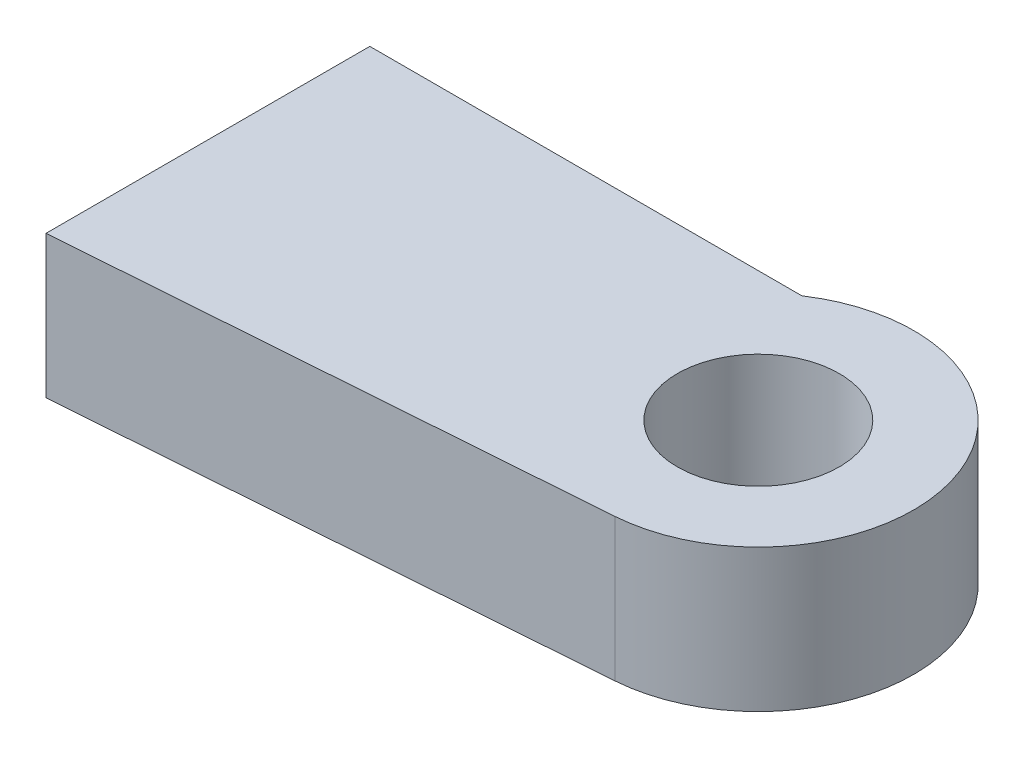
ISO-10303-21;
HEADER;
FILE_DESCRIPTION(('STEP AP214'),'2;1');
FILE_NAME('part.step','',(''),(''),'','','');
FILE_SCHEMA(('AUTOMOTIVE_DESIGN { 1 0 10303 214 1 1 1 1 }'));
ENDSEC;
DATA;
#1=APPLICATION_CONTEXT('core data for automotive mechanical design processes');
#2=APPLICATION_PROTOCOL_DEFINITION('international standard','automotive_design',2000,#1);
#3=PRODUCT_CONTEXT('',#1,'mechanical');
#4=PRODUCT('Part','Part','',(#3));
#5=PRODUCT_RELATED_PRODUCT_CATEGORY('part','',(#4));
#6=PRODUCT_DEFINITION_FORMATION('','',#4);
#7=PRODUCT_DEFINITION_CONTEXT('part definition',#1,'design');
#8=PRODUCT_DEFINITION('design','',#6,#7);
#9=PRODUCT_DEFINITION_SHAPE('','',#8);
#10=(LENGTH_UNIT() NAMED_UNIT(*) SI_UNIT(.MILLI.,.METRE.));
#11=(NAMED_UNIT(*) PLANE_ANGLE_UNIT() SI_UNIT($,.RADIAN.));
#12=(NAMED_UNIT(*) SI_UNIT($,.STERADIAN.) SOLID_ANGLE_UNIT());
#13=UNCERTAINTY_MEASURE_WITH_UNIT(LENGTH_MEASURE(1.E-05),#10,'distance_accuracy_value','');
#14=(GEOMETRIC_REPRESENTATION_CONTEXT(3) GLOBAL_UNCERTAINTY_ASSIGNED_CONTEXT((#13)) GLOBAL_UNIT_ASSIGNED_CONTEXT((#10,
#11,#12)) REPRESENTATION_CONTEXT('',''));
#15=CARTESIAN_POINT('',(0.,0.,0.));
#16=DIRECTION('',(0.,0.,1.));
#17=DIRECTION('',(1.,0.,0.));
#18=AXIS2_PLACEMENT_3D('',#15,#16,#17);
#19=CARTESIAN_POINT('',(31.9965861153568,8.8,-12.));
#20=DIRECTION('',(0.,1.,0.));
#21=DIRECTION('',(0.,0.,1.));
#22=AXIS2_PLACEMENT_3D('',#19,#20,#21);
#23=PLANE('',#22);
#24=DIRECTION('',(0.997259704354308,0.,-0.0739802816374709));
#25=VECTOR('',#24,1.);
#26=CARTESIAN_POINT('',(0.,8.8,0.));
#27=LINE('',#26,#25);
#28=CARTESIAN_POINT('',(0.,8.8,0.));
#29=VERTEX_POINT('',#28);
#30=CARTESIAN_POINT('',(32.7067968190765,8.8,-2.42630683819865));
#31=VERTEX_POINT('',#30);
#32=EDGE_CURVE('E85',#29,#31,#27,.T.);
#33=ORIENTED_EDGE('',*,*,#32,.T.);
#34=CARTESIAN_POINT('',(31.9965861153568,8.8,-12.));
#35=DIRECTION('',(0.,1.,0.));
#36=DIRECTION('',(0.,0.,1.));
#37=AXIS2_PLACEMENT_3D('',#34,#35,#36);
#38=CIRCLE('',#37,9.6);
#39=CARTESIAN_POINT('',(26.6899864507881,8.8,-20.));
#40=VERTEX_POINT('',#39);
#41=EDGE_CURVE('E80',#31,#40,#38,.T.);
#42=ORIENTED_EDGE('',*,*,#41,.T.);
#43=DIRECTION('',(-1.,0.,0.));
#44=VECTOR('',#43,1.);
#45=CARTESIAN_POINT('',(0.,8.8,-20.));
#46=LINE('',#45,#44);
#47=CARTESIAN_POINT('',(0.,8.8,-20.));
#48=VERTEX_POINT('',#47);
#49=EDGE_CURVE('E83',#40,#48,#46,.T.);
#50=ORIENTED_EDGE('',*,*,#49,.T.);
#51=DIRECTION('',(0.,0.,1.));
#52=VECTOR('',#51,1.);
#53=CARTESIAN_POINT('',(0.,8.8,0.));
#54=LINE('',#53,#52);
#55=EDGE_CURVE('E50',#48,#29,#54,.T.);
#56=ORIENTED_EDGE('',*,*,#55,.T.);
#57=EDGE_LOOP('',(#33,#42,#50,#56));
#58=FACE_BOUND('',#57,.T.);
#59=CARTESIAN_POINT('',(31.9965861153568,8.8,-12.));
#60=DIRECTION('',(0.,1.,0.));
#61=DIRECTION('',(0.,0.,1.));
#62=AXIS2_PLACEMENT_3D('',#59,#60,#61);
#63=CIRCLE('',#62,5.);
#64=CARTESIAN_POINT('',(31.9965861153568,8.8,-7.));
#65=VERTEX_POINT('',#64);
#66=EDGE_CURVE('E100',#65,#65,#63,.T.);
#67=ORIENTED_EDGE('',*,*,#66,.F.);
#68=EDGE_LOOP('',(#67));
#69=FACE_BOUND('',#68,.T.);
#70=ADVANCED_FACE('F33',(#58,#69),#23,.T.);
#71=CARTESIAN_POINT('',(31.9965861153568,0.,-12.));
#72=DIRECTION('',(0.,1.,0.));
#73=DIRECTION('',(0.,0.,1.));
#74=AXIS2_PLACEMENT_3D('',#71,#72,#73);
#75=PLANE('',#74);
#76=DIRECTION('',(0.997259704354308,0.,-0.0739802816374709));
#77=VECTOR('',#76,1.);
#78=CARTESIAN_POINT('',(0.,0.,0.));
#79=LINE('',#78,#77);
#80=CARTESIAN_POINT('',(0.,0.,0.));
#81=VERTEX_POINT('',#80);
#82=CARTESIAN_POINT('',(32.7067968190765,0.,-2.42630683819865));
#83=VERTEX_POINT('',#82);
#84=EDGE_CURVE('E97',#81,#83,#79,.T.);
#85=ORIENTED_EDGE('',*,*,#84,.F.);
#86=DIRECTION('',(0.,0.,1.));
#87=VECTOR('',#86,1.);
#88=CARTESIAN_POINT('',(0.,0.,0.));
#89=LINE('',#88,#87);
#90=CARTESIAN_POINT('',(0.,0.,-20.));
#91=VERTEX_POINT('',#90);
#92=EDGE_CURVE('E73',#91,#81,#89,.T.);
#93=ORIENTED_EDGE('',*,*,#92,.F.);
#94=DIRECTION('',(-1.,0.,0.));
#95=VECTOR('',#94,1.);
#96=CARTESIAN_POINT('',(0.,0.,-20.));
#97=LINE('',#96,#95);
#98=CARTESIAN_POINT('',(26.6899864507881,0.,-20.));
#99=VERTEX_POINT('',#98);
#100=EDGE_CURVE('E67',#99,#91,#97,.T.);
#101=ORIENTED_EDGE('',*,*,#100,.F.);
#102=CARTESIAN_POINT('',(31.9965861153568,0.,-12.));
#103=DIRECTION('',(0.,1.,0.));
#104=DIRECTION('',(0.,0.,1.));
#105=AXIS2_PLACEMENT_3D('',#102,#103,#104);
#106=CIRCLE('',#105,9.6);
#107=EDGE_CURVE('E89',#83,#99,#106,.T.);
#108=ORIENTED_EDGE('',*,*,#107,.F.);
#109=EDGE_LOOP('',(#85,#93,#101,#108));
#110=FACE_BOUND('',#109,.T.);
#111=CARTESIAN_POINT('',(31.9965861153568,0.,-12.));
#112=DIRECTION('',(0.,1.,0.));
#113=DIRECTION('',(0.,0.,1.));
#114=AXIS2_PLACEMENT_3D('',#111,#112,#113);
#115=CIRCLE('',#114,5.);
#116=CARTESIAN_POINT('',(31.9965861153568,0.,-7.));
#117=VERTEX_POINT('',#116);
#118=EDGE_CURVE('E112',#117,#117,#115,.T.);
#119=ORIENTED_EDGE('',*,*,#118,.T.);
#120=EDGE_LOOP('',(#119));
#121=FACE_BOUND('',#120,.T.);
#122=ADVANCED_FACE('F108',(#110,#121),#75,.F.);
#123=CARTESIAN_POINT('',(0.,8.8,0.));
#124=DIRECTION('',(-0.0739802816374709,0.,-0.997259704354307));
#125=DIRECTION('',(-0.997259704354307,0.,0.0739802816374709));
#126=AXIS2_PLACEMENT_3D('',#123,#124,#125);
#127=PLANE('',#126);
#128=ORIENTED_EDGE('',*,*,#84,.T.);
#129=DIRECTION('',(0.,-1.,0.));
#130=VECTOR('',#129,1.);
#131=CARTESIAN_POINT('',(32.7067968190765,8.8,-2.42630683819865));
#132=LINE('',#131,#130);
#133=EDGE_CURVE('E11',#31,#83,#132,.T.);
#134=ORIENTED_EDGE('',*,*,#133,.F.);
#135=ORIENTED_EDGE('',*,*,#32,.F.);
#136=DIRECTION('',(0.,-1.,0.));
#137=VECTOR('',#136,1.);
#138=CARTESIAN_POINT('',(0.,8.8,0.));
#139=LINE('',#138,#137);
#140=EDGE_CURVE('E93',#29,#81,#139,.T.);
#141=ORIENTED_EDGE('',*,*,#140,.T.);
#142=EDGE_LOOP('',(#128,#134,#135,#141));
#143=FACE_BOUND('',#142,.T.);
#144=ADVANCED_FACE('F35',(#143),#127,.F.);
#145=CARTESIAN_POINT('',(31.9965861153568,8.8,-12.));
#146=DIRECTION('',(0.,-1.,0.));
#147=DIRECTION('',(0.,0.,-1.));
#148=AXIS2_PLACEMENT_3D('',#145,#146,#147);
#149=CYLINDRICAL_SURFACE('',#148,9.6);
#150=ORIENTED_EDGE('',*,*,#107,.T.);
#151=DIRECTION('',(0.,-1.,0.));
#152=VECTOR('',#151,1.);
#153=CARTESIAN_POINT('',(26.6899864507881,8.8,-20.));
#154=LINE('',#153,#152);
#155=EDGE_CURVE('E42',#40,#99,#154,.T.);
#156=ORIENTED_EDGE('',*,*,#155,.F.);
#157=ORIENTED_EDGE('',*,*,#41,.F.);
#158=ORIENTED_EDGE('',*,*,#133,.T.);
#159=EDGE_LOOP('',(#150,#156,#157,#158));
#160=FACE_BOUND('',#159,.T.);
#161=ADVANCED_FACE('F88',(#160),#149,.T.);
#162=CARTESIAN_POINT('',(0.,8.8,-20.));
#163=DIRECTION('',(0.,0.,1.));
#164=DIRECTION('',(1.,0.,0.));
#165=AXIS2_PLACEMENT_3D('',#162,#163,#164);
#166=PLANE('',#165);
#167=ORIENTED_EDGE('',*,*,#100,.T.);
#168=DIRECTION('',(0.,-1.,0.));
#169=VECTOR('',#168,1.);
#170=CARTESIAN_POINT('',(0.,8.8,-20.));
#171=LINE('',#170,#169);
#172=EDGE_CURVE('E90',#48,#91,#171,.T.);
#173=ORIENTED_EDGE('',*,*,#172,.F.);
#174=ORIENTED_EDGE('',*,*,#49,.F.);
#175=ORIENTED_EDGE('',*,*,#155,.T.);
#176=EDGE_LOOP('',(#167,#173,#174,#175));
#177=FACE_BOUND('',#176,.T.);
#178=ADVANCED_FACE('F91',(#177),#166,.F.);
#179=CARTESIAN_POINT('',(0.,8.8,0.));
#180=DIRECTION('',(1.,0.,0.));
#181=DIRECTION('',(0.,0.,-1.));
#182=AXIS2_PLACEMENT_3D('',#179,#180,#181);
#183=PLANE('',#182);
#184=ORIENTED_EDGE('',*,*,#92,.T.);
#185=ORIENTED_EDGE('',*,*,#140,.F.);
#186=ORIENTED_EDGE('',*,*,#55,.F.);
#187=ORIENTED_EDGE('',*,*,#172,.T.);
#188=EDGE_LOOP('',(#184,#185,#186,#187));
#189=FACE_BOUND('',#188,.T.);
#190=ADVANCED_FACE('F105',(#189),#183,.F.);
#191=CARTESIAN_POINT('',(31.9965861153568,8.8,-12.));
#192=DIRECTION('',(0.,-1.,0.));
#193=DIRECTION('',(0.,0.,-1.));
#194=AXIS2_PLACEMENT_3D('',#191,#192,#193);
#195=CYLINDRICAL_SURFACE('',#194,5.);
#196=ORIENTED_EDGE('',*,*,#66,.T.);
#197=EDGE_LOOP('',(#196));
#198=FACE_BOUND('',#197,.T.);
#199=ORIENTED_EDGE('',*,*,#118,.F.);
#200=EDGE_LOOP('',(#199));
#201=FACE_BOUND('',#200,.T.);
#202=ADVANCED_FACE('F118',(#198,#201),#195,.F.);
#203=CLOSED_SHELL('',(#70,#122,#144,#161,#178,#190,#202));
#204=MANIFOLD_SOLID_BREP('B2',#203);
#205=ADVANCED_BREP_SHAPE_REPRESENTATION('',(#18,#204),#14);
#206=SHAPE_DEFINITION_REPRESENTATION(#9,#205);
ENDSEC;
END-ISO-10303-21;
